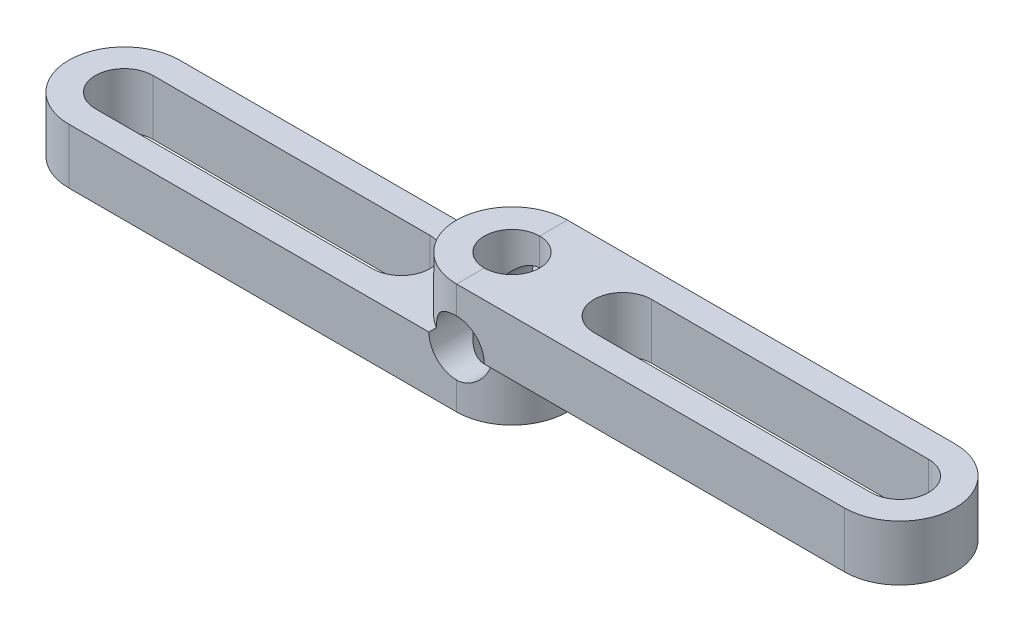
ISO-10303-21;
HEADER;
FILE_DESCRIPTION(('STEP AP214'),'2;1');
FILE_NAME('part.step','',(''),(''),'','','');
FILE_SCHEMA(('AUTOMOTIVE_DESIGN { 1 0 10303 214 1 1 1 1 }'));
ENDSEC;
DATA;
#1=APPLICATION_CONTEXT('core data for automotive mechanical design processes');
#2=APPLICATION_PROTOCOL_DEFINITION('international standard','automotive_design',2000,#1);
#3=PRODUCT_CONTEXT('',#1,'mechanical');
#4=PRODUCT('Part','Part','',(#3));
#5=PRODUCT_RELATED_PRODUCT_CATEGORY('part','',(#4));
#6=PRODUCT_DEFINITION_FORMATION('','',#4);
#7=PRODUCT_DEFINITION_CONTEXT('part definition',#1,'design');
#8=PRODUCT_DEFINITION('design','',#6,#7);
#9=PRODUCT_DEFINITION_SHAPE('','',#8);
#10=(LENGTH_UNIT() NAMED_UNIT(*) SI_UNIT(.MILLI.,.METRE.));
#11=(NAMED_UNIT(*) PLANE_ANGLE_UNIT() SI_UNIT($,.RADIAN.));
#12=(NAMED_UNIT(*) SI_UNIT($,.STERADIAN.) SOLID_ANGLE_UNIT());
#13=UNCERTAINTY_MEASURE_WITH_UNIT(LENGTH_MEASURE(1.E-05),#10,'distance_accuracy_value','');
#14=(GEOMETRIC_REPRESENTATION_CONTEXT(3) GLOBAL_UNCERTAINTY_ASSIGNED_CONTEXT((#13)) GLOBAL_UNIT_ASSIGNED_CONTEXT((#10,
#11,#12)) REPRESENTATION_CONTEXT('',''));
#15=CARTESIAN_POINT('',(0.,0.,0.));
#16=DIRECTION('',(0.,0.,1.));
#17=DIRECTION('',(1.,0.,0.));
#18=AXIS2_PLACEMENT_3D('',#15,#16,#17);
#19=CARTESIAN_POINT('',(0.,12.7,-6.35));
#20=DIRECTION('',(1.,0.,0.));
#21=DIRECTION('',(0.,0.,-1.));
#22=AXIS2_PLACEMENT_3D('',#19,#20,#21);
#23=PLANE('',#22);
#24=DIRECTION('',(0.,0.,1.));
#25=VECTOR('',#24,1.);
#26=CARTESIAN_POINT('',(0.,9.525,-6.35000000000003));
#27=LINE('',#26,#25);
#28=CARTESIAN_POINT('',(0.,9.525,-6.35000000000003));
#29=VERTEX_POINT('',#28);
#30=CARTESIAN_POINT('',(0.,9.525,-3.175));
#31=VERTEX_POINT('',#30);
#32=EDGE_CURVE('E210',#29,#31,#27,.T.);
#33=ORIENTED_EDGE('',*,*,#32,.T.);
#34=DIRECTION('',(0.,1.,0.));
#35=VECTOR('',#34,1.);
#36=CARTESIAN_POINT('',(0.,0.,-3.175));
#37=LINE('',#36,#35);
#38=CARTESIAN_POINT('',(0.,12.7,-3.175));
#39=VERTEX_POINT('',#38);
#40=EDGE_CURVE('E144',#31,#39,#37,.T.);
#41=ORIENTED_EDGE('',*,*,#40,.T.);
#42=DIRECTION('',(0.,0.,1.));
#43=VECTOR('',#42,1.);
#44=CARTESIAN_POINT('',(0.,12.7,-6.35));
#45=LINE('',#44,#43);
#46=CARTESIAN_POINT('',(0.,12.7,-6.35));
#47=VERTEX_POINT('',#46);
#48=EDGE_CURVE('E152',#47,#39,#45,.T.);
#49=ORIENTED_EDGE('',*,*,#48,.F.);
#50=DIRECTION('',(0.,-1.,0.));
#51=VECTOR('',#50,1.);
#52=CARTESIAN_POINT('',(0.,12.7,-6.35));
#53=LINE('',#52,#51);
#54=EDGE_CURVE('E172',#47,#29,#53,.T.);
#55=ORIENTED_EDGE('',*,*,#54,.T.);
#56=EDGE_LOOP('',(#33,#41,#49,#55));
#57=FACE_BOUND('',#56,.T.);
#58=ADVANCED_FACE('F53',(#57),#23,.F.);
#59=CARTESIAN_POINT('',(0.,6.35,-6.35000000000003));
#60=DIRECTION('',(0.,0.,1.));
#61=DIRECTION('',(1.,0.,0.));
#62=AXIS2_PLACEMENT_3D('',#59,#60,#61);
#63=CYLINDRICAL_SURFACE('',#62,3.175);
#64=DIRECTION('',(0.,0.,1.));
#65=VECTOR('',#64,1.);
#66=CARTESIAN_POINT('',(3.175,6.35,-6.35000000000003));
#67=LINE('',#66,#65);
#68=CARTESIAN_POINT('',(3.175,6.35,-6.35));
#69=VERTEX_POINT('',#68);
#70=CARTESIAN_POINT('',(3.175,6.35,0.));
#71=VERTEX_POINT('',#70);
#72=EDGE_CURVE('E195',#69,#71,#67,.T.);
#73=ORIENTED_EDGE('',*,*,#72,.T.);
#74=CARTESIAN_POINT('',(0.,6.35,0.));
#75=DIRECTION('',(0.,0.707106781186547,0.707106781186547));
#76=DIRECTION('',(0.,-0.707106781186547,0.707106781186547));
#77=AXIS2_PLACEMENT_3D('',#74,#75,#76);
#78=ELLIPSE('',#77,4.49012806053458,3.175);
#79=EDGE_CURVE('E12',#71,#31,#78,.T.);
#80=ORIENTED_EDGE('',*,*,#79,.T.);
#81=ORIENTED_EDGE('',*,*,#32,.F.);
#82=CARTESIAN_POINT('',(0.,6.35,-6.35000000000003));
#83=DIRECTION('',(0.,0.,1.));
#84=DIRECTION('',(1.,0.,0.));
#85=AXIS2_PLACEMENT_3D('',#82,#83,#84);
#86=CIRCLE('',#85,3.175);
#87=EDGE_CURVE('E74',#69,#29,#86,.T.);
#88=ORIENTED_EDGE('',*,*,#87,.F.);
#89=EDGE_LOOP('',(#73,#80,#81,#88));
#90=FACE_BOUND('',#89,.T.);
#91=ADVANCED_FACE('F208',(#90),#63,.F.);
#92=CARTESIAN_POINT('',(0.,12.7,3.175));
#93=VERTEX_POINT('',#92);
#94=CARTESIAN_POINT('',(0.,12.7,6.35));
#95=VERTEX_POINT('',#94);
#96=EDGE_CURVE('E149',#93,#95,#45,.T.);
#97=ORIENTED_EDGE('',*,*,#96,.F.);
#98=DIRECTION('',(0.,1.,0.));
#99=VECTOR('',#98,1.);
#100=CARTESIAN_POINT('',(0.,0.,3.175));
#101=LINE('',#100,#99);
#102=CARTESIAN_POINT('',(0.,9.525,3.175));
#103=VERTEX_POINT('',#102);
#104=EDGE_CURVE('E136',#93,#103,#101,.F.);
#105=ORIENTED_EDGE('',*,*,#104,.T.);
#106=CARTESIAN_POINT('',(0.,9.525,6.35));
#107=VERTEX_POINT('',#106);
#108=EDGE_CURVE('E201',#103,#107,#27,.T.);
#109=ORIENTED_EDGE('',*,*,#108,.T.);
#110=DIRECTION('',(0.,-1.,0.));
#111=VECTOR('',#110,1.);
#112=CARTESIAN_POINT('',(0.,12.7,6.35));
#113=LINE('',#112,#111);
#114=EDGE_CURVE('E156',#95,#107,#113,.T.);
#115=ORIENTED_EDGE('',*,*,#114,.F.);
#116=EDGE_LOOP('',(#97,#105,#109,#115));
#117=FACE_BOUND('',#116,.T.);
#118=ADVANCED_FACE('F55',(#117),#23,.F.);
#119=CARTESIAN_POINT('',(0.,12.7,6.35));
#120=DIRECTION('',(0.,0.,-1.));
#121=DIRECTION('',(-1.,0.,0.));
#122=AXIS2_PLACEMENT_3D('',#119,#120,#121);
#123=PLANE('',#122);
#124=ORIENTED_EDGE('',*,*,#114,.T.);
#125=CARTESIAN_POINT('',(0.,6.35,6.35));
#126=DIRECTION('',(0.,0.,1.));
#127=DIRECTION('',(1.,0.,0.));
#128=AXIS2_PLACEMENT_3D('',#125,#126,#127);
#129=CIRCLE('',#128,3.175);
#130=CARTESIAN_POINT('',(3.175,6.35,6.35));
#131=VERTEX_POINT('',#130);
#132=EDGE_CURVE('E219',#131,#107,#129,.T.);
#133=ORIENTED_EDGE('',*,*,#132,.F.);
#134=DIRECTION('',(1.,0.,0.));
#135=VECTOR('',#134,1.);
#136=CARTESIAN_POINT('',(0.,6.35,6.35));
#137=LINE('',#136,#135);
#138=CARTESIAN_POINT('',(44.45,6.35,6.35));
#139=VERTEX_POINT('',#138);
#140=EDGE_CURVE('E173',#131,#139,#137,.T.);
#141=ORIENTED_EDGE('',*,*,#140,.T.);
#142=DIRECTION('',(0.,-1.,0.));
#143=VECTOR('',#142,1.);
#144=CARTESIAN_POINT('',(44.45,12.7,6.35));
#145=LINE('',#144,#143);
#146=CARTESIAN_POINT('',(44.45,12.7,6.35));
#147=VERTEX_POINT('',#146);
#148=EDGE_CURVE('E181',#147,#139,#145,.T.);
#149=ORIENTED_EDGE('',*,*,#148,.F.);
#150=DIRECTION('',(1.,0.,0.));
#151=VECTOR('',#150,1.);
#152=CARTESIAN_POINT('',(0.,12.7,6.35));
#153=LINE('',#152,#151);
#154=EDGE_CURVE('E159',#95,#147,#153,.T.);
#155=ORIENTED_EDGE('',*,*,#154,.F.);
#156=EDGE_LOOP('',(#124,#133,#141,#149,#155));
#157=FACE_BOUND('',#156,.T.);
#158=ADVANCED_FACE('F269',(#157),#123,.F.);
#159=CARTESIAN_POINT('',(44.45,12.7,0.));
#160=DIRECTION('',(0.,-1.,0.));
#161=DIRECTION('',(0.,0.,-1.));
#162=AXIS2_PLACEMENT_3D('',#159,#160,#161);
#163=CYLINDRICAL_SURFACE('',#162,6.35000000000002);
#164=CARTESIAN_POINT('',(44.45,6.35,0.));
#165=DIRECTION('',(0.,1.,0.));
#166=DIRECTION('',(0.,0.,-1.));
#167=AXIS2_PLACEMENT_3D('',#164,#165,#166);
#168=CIRCLE('',#167,6.35000000000002);
#169=CARTESIAN_POINT('',(44.45,6.35,-6.35000000000003));
#170=VERTEX_POINT('',#169);
#171=EDGE_CURVE('E161',#139,#170,#168,.T.);
#172=ORIENTED_EDGE('',*,*,#171,.T.);
#173=DIRECTION('',(0.,-1.,0.));
#174=VECTOR('',#173,1.);
#175=CARTESIAN_POINT('',(44.45,12.7,-6.35000000000003));
#176=LINE('',#175,#174);
#177=CARTESIAN_POINT('',(44.45,12.7,-6.35000000000003));
#178=VERTEX_POINT('',#177);
#179=EDGE_CURVE('E178',#178,#170,#176,.T.);
#180=ORIENTED_EDGE('',*,*,#179,.F.);
#181=CARTESIAN_POINT('',(44.45,12.7,0.));
#182=DIRECTION('',(0.,1.,0.));
#183=DIRECTION('',(0.,0.,-1.));
#184=AXIS2_PLACEMENT_3D('',#181,#182,#183);
#185=CIRCLE('',#184,6.35000000000002);
#186=EDGE_CURVE('E168',#147,#178,#185,.T.);
#187=ORIENTED_EDGE('',*,*,#186,.F.);
#188=ORIENTED_EDGE('',*,*,#148,.T.);
#189=EDGE_LOOP('',(#172,#180,#187,#188));
#190=FACE_BOUND('',#189,.T.);
#191=ADVANCED_FACE('F273',(#190),#163,.T.);
#192=CARTESIAN_POINT('',(0.,12.7,-6.35));
#193=DIRECTION('',(0.,0.,1.));
#194=DIRECTION('',(1.,0.,0.));
#195=AXIS2_PLACEMENT_3D('',#192,#193,#194);
#196=PLANE('',#195);
#197=DIRECTION('',(-1.,0.,0.));
#198=VECTOR('',#197,1.);
#199=CARTESIAN_POINT('',(0.,6.35,-6.35));
#200=LINE('',#199,#198);
#201=EDGE_CURVE('E157',#170,#69,#200,.T.);
#202=ORIENTED_EDGE('',*,*,#201,.T.);
#203=ORIENTED_EDGE('',*,*,#87,.T.);
#204=ORIENTED_EDGE('',*,*,#54,.F.);
#205=DIRECTION('',(-1.,0.,0.));
#206=VECTOR('',#205,1.);
#207=CARTESIAN_POINT('',(0.,12.7,-6.35));
#208=LINE('',#207,#206);
#209=EDGE_CURVE('E170',#178,#47,#208,.T.);
#210=ORIENTED_EDGE('',*,*,#209,.F.);
#211=ORIENTED_EDGE('',*,*,#179,.T.);
#212=EDGE_LOOP('',(#202,#203,#204,#210,#211));
#213=FACE_BOUND('',#212,.T.);
#214=ADVANCED_FACE('F278',(#213),#196,.F.);
#215=CARTESIAN_POINT('',(44.45,12.7,0.));
#216=DIRECTION('',(0.,-1.,0.));
#217=DIRECTION('',(0.,0.,-1.));
#218=AXIS2_PLACEMENT_3D('',#215,#216,#217);
#219=PLANE('',#218);
#220=DIRECTION('',(-1.,0.,0.));
#221=VECTOR('',#220,1.);
#222=CARTESIAN_POINT('',(44.45,12.7,-3.302));
#223=LINE('',#222,#221);
#224=CARTESIAN_POINT('',(44.45,12.7,-3.302));
#225=VERTEX_POINT('',#224);
#226=CARTESIAN_POINT('',(12.7,12.7,-3.302));
#227=VERTEX_POINT('',#226);
#228=EDGE_CURVE('E232',#225,#227,#223,.T.);
#229=ORIENTED_EDGE('',*,*,#228,.F.);
#230=CARTESIAN_POINT('',(44.45,12.7,0.));
#231=DIRECTION('',(0.,1.,0.));
#232=DIRECTION('',(0.,0.,1.));
#233=AXIS2_PLACEMENT_3D('',#230,#231,#232);
#234=CIRCLE('',#233,3.302);
#235=CARTESIAN_POINT('',(44.45,12.7,3.302));
#236=VERTEX_POINT('',#235);
#237=EDGE_CURVE('E165',#236,#225,#234,.T.);
#238=ORIENTED_EDGE('',*,*,#237,.F.);
#239=DIRECTION('',(1.,0.,0.));
#240=VECTOR('',#239,1.);
#241=CARTESIAN_POINT('',(44.45,12.7,3.302));
#242=LINE('',#241,#240);
#243=CARTESIAN_POINT('',(12.7,12.7,3.302));
#244=VERTEX_POINT('',#243);
#245=EDGE_CURVE('E224',#244,#236,#242,.T.);
#246=ORIENTED_EDGE('',*,*,#245,.F.);
#247=CARTESIAN_POINT('',(12.7,12.7,0.));
#248=DIRECTION('',(0.,1.,0.));
#249=DIRECTION('',(0.,0.,1.));
#250=AXIS2_PLACEMENT_3D('',#247,#248,#249);
#251=CIRCLE('',#250,3.302);
#252=EDGE_CURVE('E230',#227,#244,#251,.T.);
#253=ORIENTED_EDGE('',*,*,#252,.F.);
#254=EDGE_LOOP('',(#229,#238,#246,#253));
#255=FACE_BOUND('',#254,.T.);
#256=ORIENTED_EDGE('',*,*,#48,.T.);
#257=CARTESIAN_POINT('',(0.,12.7,0.));
#258=DIRECTION('',(0.,1.,0.));
#259=DIRECTION('',(0.,0.,1.));
#260=AXIS2_PLACEMENT_3D('',#257,#258,#259);
#261=CIRCLE('',#260,3.175);
#262=EDGE_CURVE('E139',#93,#39,#261,.T.);
#263=ORIENTED_EDGE('',*,*,#262,.F.);
#264=ORIENTED_EDGE('',*,*,#96,.T.);
#265=ORIENTED_EDGE('',*,*,#154,.T.);
#266=ORIENTED_EDGE('',*,*,#186,.T.);
#267=ORIENTED_EDGE('',*,*,#209,.T.);
#268=EDGE_LOOP('',(#256,#263,#264,#265,#266,#267));
#269=FACE_BOUND('',#268,.T.);
#270=ADVANCED_FACE('F148',(#255,#269),#219,.F.);
#271=CARTESIAN_POINT('',(44.45,6.35,0.));
#272=DIRECTION('',(0.,-1.,0.));
#273=DIRECTION('',(0.,0.,-1.));
#274=AXIS2_PLACEMENT_3D('',#271,#272,#273);
#275=PLANE('',#274);
#276=ORIENTED_EDGE('',*,*,#72,.F.);
#277=ORIENTED_EDGE('',*,*,#201,.F.);
#278=ORIENTED_EDGE('',*,*,#171,.F.);
#279=ORIENTED_EDGE('',*,*,#140,.F.);
#280=EDGE_CURVE('E194',#71,#131,#67,.T.);
#281=ORIENTED_EDGE('',*,*,#280,.F.);
#282=EDGE_LOOP('',(#276,#277,#278,#279,#281));
#283=FACE_BOUND('',#282,.T.);
#284=CARTESIAN_POINT('',(44.45,6.35,0.));
#285=DIRECTION('',(0.,-1.,0.));
#286=DIRECTION('',(0.,0.,-1.));
#287=AXIS2_PLACEMENT_3D('',#284,#285,#286);
#288=CIRCLE('',#287,3.302);
#289=CARTESIAN_POINT('',(44.45,6.35,-3.302));
#290=VERTEX_POINT('',#289);
#291=CARTESIAN_POINT('',(44.45,6.35,3.302));
#292=VERTEX_POINT('',#291);
#293=EDGE_CURVE('E192',#290,#292,#288,.T.);
#294=ORIENTED_EDGE('',*,*,#293,.F.);
#295=DIRECTION('',(1.,0.,0.));
#296=VECTOR('',#295,1.);
#297=CARTESIAN_POINT('',(44.45,6.35,-3.302));
#298=LINE('',#297,#296);
#299=CARTESIAN_POINT('',(12.7,6.35,-3.302));
#300=VERTEX_POINT('',#299);
#301=EDGE_CURVE('E185',#300,#290,#298,.T.);
#302=ORIENTED_EDGE('',*,*,#301,.F.);
#303=CARTESIAN_POINT('',(12.7,6.35,0.));
#304=DIRECTION('',(0.,-1.,0.));
#305=DIRECTION('',(0.,0.,-1.));
#306=AXIS2_PLACEMENT_3D('',#303,#304,#305);
#307=CIRCLE('',#306,3.302);
#308=CARTESIAN_POINT('',(12.7,6.35,3.302));
#309=VERTEX_POINT('',#308);
#310=EDGE_CURVE('E187',#309,#300,#307,.T.);
#311=ORIENTED_EDGE('',*,*,#310,.F.);
#312=DIRECTION('',(-1.,0.,0.));
#313=VECTOR('',#312,1.);
#314=CARTESIAN_POINT('',(44.45,6.35,3.302));
#315=LINE('',#314,#313);
#316=EDGE_CURVE('E190',#292,#309,#315,.T.);
#317=ORIENTED_EDGE('',*,*,#316,.F.);
#318=EDGE_LOOP('',(#294,#302,#311,#317));
#319=FACE_BOUND('',#318,.T.);
#320=ADVANCED_FACE('F204',(#283,#319),#275,.T.);
#321=CARTESIAN_POINT('',(44.45,0.,0.));
#322=DIRECTION('',(0.,1.,0.));
#323=DIRECTION('',(0.,0.,1.));
#324=AXIS2_PLACEMENT_3D('',#321,#322,#323);
#325=CYLINDRICAL_SURFACE('',#324,3.302);
#326=ORIENTED_EDGE('',*,*,#293,.T.);
#327=DIRECTION('',(0.,1.,0.));
#328=VECTOR('',#327,1.);
#329=CARTESIAN_POINT('',(44.45,0.,3.302));
#330=LINE('',#329,#328);
#331=EDGE_CURVE('E213',#292,#236,#330,.T.);
#332=ORIENTED_EDGE('',*,*,#331,.T.);
#333=ORIENTED_EDGE('',*,*,#237,.T.);
#334=DIRECTION('',(0.,1.,0.));
#335=VECTOR('',#334,1.);
#336=CARTESIAN_POINT('',(44.45,0.,-3.302));
#337=LINE('',#336,#335);
#338=EDGE_CURVE('E221',#290,#225,#337,.T.);
#339=ORIENTED_EDGE('',*,*,#338,.F.);
#340=EDGE_LOOP('',(#326,#332,#333,#339));
#341=FACE_BOUND('',#340,.T.);
#342=ADVANCED_FACE('F240',(#341),#325,.F.);
#343=CARTESIAN_POINT('',(44.45,0.,3.302));
#344=DIRECTION('',(0.,0.,1.));
#345=DIRECTION('',(1.,0.,0.));
#346=AXIS2_PLACEMENT_3D('',#343,#344,#345);
#347=PLANE('',#346);
#348=ORIENTED_EDGE('',*,*,#316,.T.);
#349=DIRECTION('',(0.,1.,0.));
#350=VECTOR('',#349,1.);
#351=CARTESIAN_POINT('',(12.7,0.,3.302));
#352=LINE('',#351,#350);
#353=EDGE_CURVE('E215',#309,#244,#352,.T.);
#354=ORIENTED_EDGE('',*,*,#353,.T.);
#355=ORIENTED_EDGE('',*,*,#245,.T.);
#356=ORIENTED_EDGE('',*,*,#331,.F.);
#357=EDGE_LOOP('',(#348,#354,#355,#356));
#358=FACE_BOUND('',#357,.T.);
#359=ADVANCED_FACE('F253',(#358),#347,.F.);
#360=CARTESIAN_POINT('',(12.7,0.,0.));
#361=DIRECTION('',(0.,1.,0.));
#362=DIRECTION('',(0.,0.,1.));
#363=AXIS2_PLACEMENT_3D('',#360,#361,#362);
#364=CYLINDRICAL_SURFACE('',#363,3.302);
#365=ORIENTED_EDGE('',*,*,#310,.T.);
#366=DIRECTION('',(0.,1.,0.));
#367=VECTOR('',#366,1.);
#368=CARTESIAN_POINT('',(12.7,0.,-3.302));
#369=LINE('',#368,#367);
#370=EDGE_CURVE('E225',#300,#227,#369,.T.);
#371=ORIENTED_EDGE('',*,*,#370,.T.);
#372=ORIENTED_EDGE('',*,*,#252,.T.);
#373=ORIENTED_EDGE('',*,*,#353,.F.);
#374=EDGE_LOOP('',(#365,#371,#372,#373));
#375=FACE_BOUND('',#374,.T.);
#376=ADVANCED_FACE('F249',(#375),#364,.F.);
#377=CARTESIAN_POINT('',(44.45,0.,-3.302));
#378=DIRECTION('',(0.,0.,-1.));
#379=DIRECTION('',(-1.,0.,0.));
#380=AXIS2_PLACEMENT_3D('',#377,#378,#379);
#381=PLANE('',#380);
#382=ORIENTED_EDGE('',*,*,#301,.T.);
#383=ORIENTED_EDGE('',*,*,#338,.T.);
#384=ORIENTED_EDGE('',*,*,#228,.T.);
#385=ORIENTED_EDGE('',*,*,#370,.F.);
#386=EDGE_LOOP('',(#382,#383,#384,#385));
#387=FACE_BOUND('',#386,.T.);
#388=ADVANCED_FACE('F245',(#387),#381,.F.);
#389=ORIENTED_EDGE('',*,*,#108,.F.);
#390=CARTESIAN_POINT('',(0.,6.35,0.));
#391=DIRECTION('',(0.,-0.707106781186547,0.707106781186547));
#392=DIRECTION('',(0.,0.707106781186547,0.707106781186547));
#393=AXIS2_PLACEMENT_3D('',#390,#391,#392);
#394=ELLIPSE('',#393,4.49012806053458,3.175);
#395=EDGE_CURVE('E61',#103,#71,#394,.F.);
#396=ORIENTED_EDGE('',*,*,#395,.T.);
#397=ORIENTED_EDGE('',*,*,#280,.T.);
#398=ORIENTED_EDGE('',*,*,#132,.T.);
#399=EDGE_LOOP('',(#389,#396,#397,#398));
#400=FACE_BOUND('',#399,.T.);
#401=ADVANCED_FACE('F198',(#400),#63,.F.);
#402=CARTESIAN_POINT('',(0.,0.,0.));
#403=DIRECTION('',(0.,1.,0.));
#404=DIRECTION('',(0.,0.,1.));
#405=AXIS2_PLACEMENT_3D('',#402,#403,#404);
#406=CYLINDRICAL_SURFACE('',#405,3.175);
#407=ORIENTED_EDGE('',*,*,#79,.F.);
#408=ORIENTED_EDGE('',*,*,#395,.F.);
#409=ORIENTED_EDGE('',*,*,#104,.F.);
#410=ORIENTED_EDGE('',*,*,#262,.T.);
#411=ORIENTED_EDGE('',*,*,#40,.F.);
#412=EDGE_LOOP('',(#407,#408,#409,#410,#411));
#413=FACE_BOUND('',#412,.T.);
#414=ADVANCED_FACE('F138',(#413),#406,.F.);
#415=CLOSED_SHELL('',(#58,#91,#118,#158,#191,#214,#270,#320,#342,#359,#376,#388,#401,#414));
#416=MANIFOLD_SOLID_BREP('B2',#415);
#417=CARTESIAN_POINT('',(0.,6.35,-6.35));
#418=DIRECTION('',(-1.,0.,0.));
#419=DIRECTION('',(0.,0.,1.));
#420=AXIS2_PLACEMENT_3D('',#417,#418,#419);
#421=PLANE('',#420);
#422=DIRECTION('',(0.,0.,1.));
#423=VECTOR('',#422,1.);
#424=CARTESIAN_POINT('',(0.,9.525,-6.35000000000003));
#425=LINE('',#424,#423);
#426=CARTESIAN_POINT('',(0.,9.525,6.35));
#427=VERTEX_POINT('',#426);
#428=CARTESIAN_POINT('',(0.,9.525,3.175));
#429=VERTEX_POINT('',#428);
#430=EDGE_CURVE('E534',#427,#429,#425,.F.);
#431=ORIENTED_EDGE('',*,*,#430,.T.);
#432=DIRECTION('',(0.,1.,0.));
#433=VECTOR('',#432,1.);
#434=CARTESIAN_POINT('',(0.,0.,3.175));
#435=LINE('',#434,#433);
#436=CARTESIAN_POINT('',(0.,12.7,3.175));
#437=VERTEX_POINT('',#436);
#438=EDGE_CURVE('E420',#429,#437,#435,.T.);
#439=ORIENTED_EDGE('',*,*,#438,.T.);
#440=DIRECTION('',(0.,0.,1.));
#441=VECTOR('',#440,1.);
#442=CARTESIAN_POINT('',(0.,12.7,-6.35));
#443=LINE('',#442,#441);
#444=CARTESIAN_POINT('',(0.,12.7,6.35));
#445=VERTEX_POINT('',#444);
#446=EDGE_CURVE('E532',#437,#445,#443,.T.);
#447=ORIENTED_EDGE('',*,*,#446,.T.);
#448=DIRECTION('',(0.,-1.,0.));
#449=VECTOR('',#448,1.);
#450=CARTESIAN_POINT('',(0.,26.8990316571237,6.35));
#451=LINE('',#450,#449);
#452=EDGE_CURVE('E543',#445,#427,#451,.T.);
#453=ORIENTED_EDGE('',*,*,#452,.T.);
#454=EDGE_LOOP('',(#431,#439,#447,#453));
#455=FACE_BOUND('',#454,.T.);
#456=ADVANCED_FACE('F404',(#455),#421,.F.);
#457=CARTESIAN_POINT('',(0.,6.35,-6.35000000000003));
#458=DIRECTION('',(0.,0.,1.));
#459=DIRECTION('',(1.,0.,0.));
#460=AXIS2_PLACEMENT_3D('',#457,#458,#459);
#461=CYLINDRICAL_SURFACE('',#460,3.175);
#462=DIRECTION('',(0.,0.,1.));
#463=VECTOR('',#462,1.);
#464=CARTESIAN_POINT('',(3.175,6.35,-6.35000000000003));
#465=LINE('',#464,#463);
#466=CARTESIAN_POINT('',(3.175,6.35,0.));
#467=VERTEX_POINT('',#466);
#468=CARTESIAN_POINT('',(3.175,6.35,5.49926131403118));
#469=VERTEX_POINT('',#468);
#470=EDGE_CURVE('E428',#467,#469,#465,.T.);
#471=ORIENTED_EDGE('',*,*,#470,.F.);
#472=CARTESIAN_POINT('',(0.,6.35,0.));
#473=DIRECTION('',(0.,0.707106781186547,0.707106781186547));
#474=DIRECTION('',(0.,-0.707106781186547,0.707106781186547));
#475=AXIS2_PLACEMENT_3D('',#472,#473,#474);
#476=ELLIPSE('',#475,4.49012806053458,3.175);
#477=CARTESIAN_POINT('',(-3.175,6.35,0.));
#478=VERTEX_POINT('',#477);
#479=EDGE_CURVE('E413',#467,#478,#476,.F.);
#480=ORIENTED_EDGE('',*,*,#479,.T.);
#481=CARTESIAN_POINT('',(0.,6.35,0.));
#482=DIRECTION('',(0.,-0.707106781186547,0.707106781186547));
#483=DIRECTION('',(0.,0.707106781186547,0.707106781186547));
#484=AXIS2_PLACEMENT_3D('',#481,#482,#483);
#485=ELLIPSE('',#484,4.49012806053458,3.175);
#486=EDGE_CURVE('E588',#478,#429,#485,.F.);
#487=ORIENTED_EDGE('',*,*,#486,.T.);
#488=ORIENTED_EDGE('',*,*,#430,.F.);
#489=CARTESIAN_POINT('',(-3.175,6.35,5.49926131403119));
#490=CARTESIAN_POINT('',(-3.17501498719121,6.43315348587992,5.49923685344924));
#491=CARTESIAN_POINT('',(-3.17173382354071,6.51629338328758,5.50114671528612));
#492=CARTESIAN_POINT('',(-3.15869714313806,6.68184696811866,5.50865090863266));
#493=CARTESIAN_POINT('',(-3.14894560537063,6.76426107033193,5.51424297573809));
#494=CARTESIAN_POINT('',(-3.12316104774612,6.92729240975196,5.52888512683134));
#495=CARTESIAN_POINT('',(-3.10716488402458,7.00791730890421,5.53791491359291));
#496=CARTESIAN_POINT('',(-3.06910203618067,7.16728672184378,5.55909941202909));
#497=CARTESIAN_POINT('',(-3.0470346552152,7.24603101865081,5.57125448240751));
#498=CARTESIAN_POINT('',(-2.97217810239473,7.47834606130185,5.61176385358597));
#499=CARTESIAN_POINT('',(-2.91065539881639,7.62848860714425,5.64421020209745));
#500=CARTESIAN_POINT('',(-2.76639641445785,7.91643370951203,5.71629518378571));
#501=CARTESIAN_POINT('',(-2.68362637932182,8.05421615591001,5.75594523148095));
#502=CARTESIAN_POINT('',(-2.49130858676214,8.32582671333091,5.84190430348165));
#503=CARTESIAN_POINT('',(-2.38012496649006,8.45841086595671,5.88849271459742));
#504=CARTESIAN_POINT('',(-2.1375550773763,8.70399510300182,5.98081927134006));
#505=CARTESIAN_POINT('',(-2.00616259727512,8.81698914354543,6.0265571506922));
#506=CARTESIAN_POINT('',(-1.71598697928692,9.02774003354365,6.11575309314077));
#507=CARTESIAN_POINT('',(-1.55594882801386,9.12393824550256,6.15884463009568));
#508=CARTESIAN_POINT('',(-1.21952829116378,9.28738620889822,6.23416658978136));
#509=CARTESIAN_POINT('',(-1.04317169929491,9.35468072803303,6.266413791901));
#510=CARTESIAN_POINT('',(-0.722309013234585,9.44511884544687,6.31034764527068));
#511=CARTESIAN_POINT('',(-0.580090471214483,9.47492965183677,6.32508866065999));
#512=CARTESIAN_POINT('',(-0.364120576214716,9.50489391042673,6.33996545637804));
#513=CARTESIAN_POINT('',(-0.291578127175792,9.5124235028075,6.34371877316893));
#514=CARTESIAN_POINT('',(-0.146032175066976,9.52247959253627,6.34873950866554));
#515=CARTESIAN_POINT('',(-0.0730284946409638,9.52500403088201,6.35000590430856));
#516=CARTESIAN_POINT('',(0.,9.525,6.35));
#517=B_SPLINE_CURVE_WITH_KNOTS('',3,(#489,#490,#491,#492,#493,#494,#495,#496,#497,#498,#499,
#500,#501,#502,#503,#504,#505,#506,#507,#508,#509,#510,#511,#512,#513,#514,#515,#516),
.UNSPECIFIED.,.F.,.F.,(4,2,2,2,2,2,2,2,2,2,2,2,2,4),(0.,0.249351547487849,0.498549897096351,
0.746299174805496,0.99407690059086,1.4881562684498,1.98302546109986,2.51834801968003,
3.05383544141797,3.6257364287807,4.19674840052407,4.63320276318031,4.85209551942036,
5.0710783043069),.UNSPECIFIED.);
#518=CARTESIAN_POINT('',(-3.175,6.35,5.49926131403119));
#519=VERTEX_POINT('',#518);
#520=EDGE_CURVE('E646',#519,#427,#517,.T.);
#521=ORIENTED_EDGE('',*,*,#520,.F.);
#522=DIRECTION('',(0.,0.,1.));
#523=VECTOR('',#522,1.);
#524=CARTESIAN_POINT('',(-3.175,6.35,-6.35000000000003));
#525=LINE('',#524,#523);
#526=CARTESIAN_POINT('',(-3.175,6.35,6.35));
#527=VERTEX_POINT('',#526);
#528=EDGE_CURVE('E655',#519,#527,#525,.T.);
#529=ORIENTED_EDGE('',*,*,#528,.T.);
#530=CARTESIAN_POINT('',(0.,6.35,6.35));
#531=DIRECTION('',(0.,0.,1.));
#532=DIRECTION('',(1.,0.,0.));
#533=AXIS2_PLACEMENT_3D('',#530,#531,#532);
#534=CIRCLE('',#533,3.175);
#535=CARTESIAN_POINT('',(0.,3.175,6.35));
#536=VERTEX_POINT('',#535);
#537=EDGE_CURVE('E607',#527,#536,#534,.T.);
#538=ORIENTED_EDGE('',*,*,#537,.T.);
#539=CARTESIAN_POINT('',(0.,3.175,6.35));
#540=CARTESIAN_POINT('',(0.083815777936178,3.17498652928153,6.35001487958532));
#541=CARTESIAN_POINT('',(0.167622019642477,3.17831855679046,6.34834092674093));
#542=CARTESIAN_POINT('',(0.334549707072147,3.19156899744162,6.34172698474514));
#543=CARTESIAN_POINT('',(0.41767141430742,3.20148476480116,6.33678830757967));
#544=CARTESIAN_POINT('',(0.582255308885189,3.22773803761605,6.32378618963859));
#545=CARTESIAN_POINT('',(0.663723348649153,3.24404595674837,6.315737147699));
#546=CARTESIAN_POINT('',(0.82479718266169,3.28288295755716,6.29672917057541));
#547=CARTESIAN_POINT('',(0.904402861331964,3.30541242423835,6.2857700553105));
#548=CARTESIAN_POINT('',(1.13943586257729,3.38194064044946,6.24893735948025));
#549=CARTESIAN_POINT('',(1.29142048739768,3.44493467093902,6.21907983270533));
#550=CARTESIAN_POINT('',(1.58252314433977,3.59264992889178,6.15146777828733));
#551=CARTESIAN_POINT('',(1.72162798955291,3.67739309658915,6.11370528335323));
#552=CARTESIAN_POINT('',(1.99232683227261,3.87196307326943,6.03111275358125));
#553=CARTESIAN_POINT('',(2.12297197126314,3.98298823986502,5.98599488118471));
#554=CARTESIAN_POINT('',(2.36467132671337,4.22440030535366,5.89470617932503));
#555=CARTESIAN_POINT('',(2.47570965520395,4.35480275009027,5.8485345298544));
#556=CARTESIAN_POINT('',(2.68375207637458,4.64349051037696,5.75620709169399));
#557=CARTESIAN_POINT('',(2.77897647643195,4.8031595831083,5.71033562931831));
#558=CARTESIAN_POINT('',(2.94068251835112,5.13857983974442,5.62877812352088));
#559=CARTESIAN_POINT('',(3.00722572966873,5.31429558314371,5.59307031850783));
#560=CARTESIAN_POINT('',(3.09635580212754,5.6333191874841,5.54409657340162));
#561=CARTESIAN_POINT('',(3.12567043503839,5.77423517450281,5.52749644652047));
#562=CARTESIAN_POINT('',(3.15517353934339,5.9884212656585,5.51067129141979));
#563=CARTESIAN_POINT('',(3.16259670002373,6.06043883114209,5.50640834565842));
#564=CARTESIAN_POINT('',(3.17251367632964,6.20496189790494,5.50069738321041));
#565=CARTESIAN_POINT('',(3.17500482711295,6.27746764173828,5.49925088830329));
#566=CARTESIAN_POINT('',(3.175,6.35,5.49926131403118));
#567=B_SPLINE_CURVE_WITH_KNOTS('',3,(#539,#540,#541,#542,#543,#544,#545,#546,#547,#548,#549,
#550,#551,#552,#553,#554,#555,#556,#557,#558,#559,#560,#561,#562,#563,#564,#565,#566),
.UNSPECIFIED.,.F.,.F.,(4,2,2,2,2,2,2,2,2,2,2,2,2,4),(0.,0.25134856825677,0.50259618909939,
0.752694378001361,1.0028080470661,1.50200756918145,2.00171267008186,2.53134698863777,
3.0614085351851,3.63297471357157,4.20330773376952,4.63622947284826,4.85360109160646,
5.07109012763848),.UNSPECIFIED.);
#568=EDGE_CURVE('E615',#536,#469,#567,.T.);
#569=ORIENTED_EDGE('',*,*,#568,.T.);
#570=EDGE_LOOP('',(#471,#480,#487,#488,#521,#529,#538,#569));
#571=FACE_BOUND('',#570,.T.);
#572=ADVANCED_FACE('F597',(#571),#461,.F.);
#573=CARTESIAN_POINT('',(0.,12.7,-6.35));
#574=VERTEX_POINT('',#573);
#575=CARTESIAN_POINT('',(0.,12.7,-3.175));
#576=VERTEX_POINT('',#575);
#577=EDGE_CURVE('E542',#574,#576,#443,.T.);
#578=ORIENTED_EDGE('',*,*,#577,.T.);
#579=DIRECTION('',(0.,1.,0.));
#580=VECTOR('',#579,1.);
#581=CARTESIAN_POINT('',(0.,0.,-3.175));
#582=LINE('',#581,#580);
#583=CARTESIAN_POINT('',(0.,9.525,-3.175));
#584=VERTEX_POINT('',#583);
#585=EDGE_CURVE('E522',#576,#584,#582,.F.);
#586=ORIENTED_EDGE('',*,*,#585,.T.);
#587=CARTESIAN_POINT('',(0.,9.525,-6.35000000000003));
#588=VERTEX_POINT('',#587);
#589=EDGE_CURVE('E603',#584,#588,#425,.F.);
#590=ORIENTED_EDGE('',*,*,#589,.T.);
#591=DIRECTION('',(0.,-1.,0.));
#592=VECTOR('',#591,1.);
#593=CARTESIAN_POINT('',(0.,26.8990316571237,-6.35));
#594=LINE('',#593,#592);
#595=EDGE_CURVE('E547',#574,#588,#594,.T.);
#596=ORIENTED_EDGE('',*,*,#595,.F.);
#597=EDGE_LOOP('',(#578,#586,#590,#596));
#598=FACE_BOUND('',#597,.T.);
#599=ADVANCED_FACE('F406',(#598),#421,.F.);
#600=CARTESIAN_POINT('',(0.,6.35,-6.35));
#601=DIRECTION('',(0.,0.,1.));
#602=DIRECTION('',(1.,0.,0.));
#603=AXIS2_PLACEMENT_3D('',#600,#601,#602);
#604=PLANE('',#603);
#605=DIRECTION('',(-1.,0.,0.));
#606=VECTOR('',#605,1.);
#607=CARTESIAN_POINT('',(0.,6.35,-6.35));
#608=LINE('',#607,#606);
#609=CARTESIAN_POINT('',(-3.175,6.35,-6.35000000000003));
#610=VERTEX_POINT('',#609);
#611=CARTESIAN_POINT('',(-44.45,6.35,-6.34999999999998));
#612=VERTEX_POINT('',#611);
#613=EDGE_CURVE('E551',#610,#612,#608,.T.);
#614=ORIENTED_EDGE('',*,*,#613,.F.);
#615=CARTESIAN_POINT('',(0.,6.35,-6.35000000000003));
#616=DIRECTION('',(0.,0.,1.));
#617=DIRECTION('',(1.,0.,0.));
#618=AXIS2_PLACEMENT_3D('',#615,#616,#617);
#619=CIRCLE('',#618,3.175);
#620=CARTESIAN_POINT('',(0.,3.175,-6.35000000000003));
#621=VERTEX_POINT('',#620);
#622=EDGE_CURVE('E610',#610,#621,#619,.T.);
#623=ORIENTED_EDGE('',*,*,#622,.T.);
#624=DIRECTION('',(0.,-1.,0.));
#625=VECTOR('',#624,1.);
#626=CARTESIAN_POINT('',(0.,6.35,-6.35));
#627=LINE('',#626,#625);
#628=CARTESIAN_POINT('',(0.,0.,-6.35));
#629=VERTEX_POINT('',#628);
#630=EDGE_CURVE('E582',#621,#629,#627,.T.);
#631=ORIENTED_EDGE('',*,*,#630,.T.);
#632=DIRECTION('',(-1.,0.,0.));
#633=VECTOR('',#632,1.);
#634=CARTESIAN_POINT('',(0.,0.,-6.35));
#635=LINE('',#634,#633);
#636=CARTESIAN_POINT('',(-44.45,0.,-6.34999999999998));
#637=VERTEX_POINT('',#636);
#638=EDGE_CURVE('E563',#629,#637,#635,.T.);
#639=ORIENTED_EDGE('',*,*,#638,.T.);
#640=DIRECTION('',(0.,-1.,0.));
#641=VECTOR('',#640,1.);
#642=CARTESIAN_POINT('',(-44.45,6.35,-6.34999999999998));
#643=LINE('',#642,#641);
#644=EDGE_CURVE('E578',#612,#637,#643,.T.);
#645=ORIENTED_EDGE('',*,*,#644,.F.);
#646=EDGE_LOOP('',(#614,#623,#631,#639,#645));
#647=FACE_BOUND('',#646,.T.);
#648=ADVANCED_FACE('F746',(#647),#604,.F.);
#649=CARTESIAN_POINT('',(-44.45,6.35,0.));
#650=DIRECTION('',(0.,-1.,0.));
#651=DIRECTION('',(0.,0.,-1.));
#652=AXIS2_PLACEMENT_3D('',#649,#650,#651);
#653=CYLINDRICAL_SURFACE('',#652,6.34999999999999);
#654=CARTESIAN_POINT('',(-44.45,0.,0.));
#655=DIRECTION('',(0.,1.,0.));
#656=DIRECTION('',(0.,0.,1.));
#657=AXIS2_PLACEMENT_3D('',#654,#655,#656);
#658=CIRCLE('',#657,6.34999999999999);
#659=CARTESIAN_POINT('',(-44.45,0.,6.35));
#660=VERTEX_POINT('',#659);
#661=EDGE_CURVE('E566',#637,#660,#658,.T.);
#662=ORIENTED_EDGE('',*,*,#661,.T.);
#663=DIRECTION('',(0.,-1.,0.));
#664=VECTOR('',#663,1.);
#665=CARTESIAN_POINT('',(-44.45,6.35,6.35));
#666=LINE('',#665,#664);
#667=CARTESIAN_POINT('',(-44.45,6.35,6.35));
#668=VERTEX_POINT('',#667);
#669=EDGE_CURVE('E574',#668,#660,#666,.T.);
#670=ORIENTED_EDGE('',*,*,#669,.F.);
#671=CARTESIAN_POINT('',(-44.45,6.35,0.));
#672=DIRECTION('',(0.,1.,0.));
#673=DIRECTION('',(0.,0.,1.));
#674=AXIS2_PLACEMENT_3D('',#671,#672,#673);
#675=CIRCLE('',#674,6.34999999999999);
#676=EDGE_CURVE('E554',#612,#668,#675,.T.);
#677=ORIENTED_EDGE('',*,*,#676,.F.);
#678=ORIENTED_EDGE('',*,*,#644,.T.);
#679=EDGE_LOOP('',(#662,#670,#677,#678));
#680=FACE_BOUND('',#679,.T.);
#681=ADVANCED_FACE('F753',(#680),#653,.T.);
#682=CARTESIAN_POINT('',(0.,6.35,6.35));
#683=DIRECTION('',(0.,0.,-1.));
#684=DIRECTION('',(-1.,0.,0.));
#685=AXIS2_PLACEMENT_3D('',#682,#683,#684);
#686=PLANE('',#685);
#687=DIRECTION('',(0.,-1.,0.));
#688=VECTOR('',#687,1.);
#689=CARTESIAN_POINT('',(0.,6.35,6.35));
#690=LINE('',#689,#688);
#691=CARTESIAN_POINT('',(0.,0.,6.35));
#692=VERTEX_POINT('',#691);
#693=EDGE_CURVE('E562',#536,#692,#690,.T.);
#694=ORIENTED_EDGE('',*,*,#693,.F.);
#695=ORIENTED_EDGE('',*,*,#537,.F.);
#696=DIRECTION('',(1.,0.,0.));
#697=VECTOR('',#696,1.);
#698=CARTESIAN_POINT('',(0.,6.35,6.35));
#699=LINE('',#698,#697);
#700=EDGE_CURVE('E558',#668,#527,#699,.T.);
#701=ORIENTED_EDGE('',*,*,#700,.F.);
#702=ORIENTED_EDGE('',*,*,#669,.T.);
#703=DIRECTION('',(1.,0.,0.));
#704=VECTOR('',#703,1.);
#705=CARTESIAN_POINT('',(0.,0.,6.35));
#706=LINE('',#705,#704);
#707=EDGE_CURVE('E555',#660,#692,#706,.T.);
#708=ORIENTED_EDGE('',*,*,#707,.T.);
#709=EDGE_LOOP('',(#694,#695,#701,#702,#708));
#710=FACE_BOUND('',#709,.T.);
#711=ADVANCED_FACE('F757',(#710),#686,.F.);
#712=CARTESIAN_POINT('',(-44.45,6.35,0.));
#713=DIRECTION('',(0.,1.,0.));
#714=DIRECTION('',(0.,0.,1.));
#715=AXIS2_PLACEMENT_3D('',#712,#713,#714);
#716=PLANE('',#715);
#717=CARTESIAN_POINT('',(-3.175,6.35,-5.49926131403119));
#718=VERTEX_POINT('',#717);
#719=EDGE_CURVE('E674',#610,#718,#525,.T.);
#720=ORIENTED_EDGE('',*,*,#719,.F.);
#721=ORIENTED_EDGE('',*,*,#613,.T.);
#722=ORIENTED_EDGE('',*,*,#676,.T.);
#723=ORIENTED_EDGE('',*,*,#700,.T.);
#724=ORIENTED_EDGE('',*,*,#528,.F.);
#725=CARTESIAN_POINT('',(0.,6.35,0.));
#726=DIRECTION('',(0.,1.,0.));
#727=DIRECTION('',(0.,0.,1.));
#728=AXIS2_PLACEMENT_3D('',#725,#726,#727);
#729=CIRCLE('',#728,6.35);
#730=EDGE_CURVE('E723',#718,#519,#729,.T.);
#731=ORIENTED_EDGE('',*,*,#730,.F.);
#732=EDGE_LOOP('',(#720,#721,#722,#723,#724,#731));
#733=FACE_BOUND('',#732,.T.);
#734=CARTESIAN_POINT('',(-44.45,6.35,0.));
#735=DIRECTION('',(0.,1.,0.));
#736=DIRECTION('',(0.,0.,1.));
#737=AXIS2_PLACEMENT_3D('',#734,#735,#736);
#738=CIRCLE('',#737,3.30199999999999);
#739=CARTESIAN_POINT('',(-44.45,6.35,-3.30199999999999));
#740=VERTEX_POINT('',#739);
#741=CARTESIAN_POINT('',(-44.45,6.35,3.30199999999999));
#742=VERTEX_POINT('',#741);
#743=EDGE_CURVE('E715',#740,#742,#738,.T.);
#744=ORIENTED_EDGE('',*,*,#743,.F.);
#745=DIRECTION('',(-1.,0.,0.));
#746=VECTOR('',#745,1.);
#747=CARTESIAN_POINT('',(-44.45,6.35,-3.30199999999999));
#748=LINE('',#747,#746);
#749=CARTESIAN_POINT('',(-12.7,6.35,-3.30199999999999));
#750=VERTEX_POINT('',#749);
#751=EDGE_CURVE('E712',#750,#740,#748,.T.);
#752=ORIENTED_EDGE('',*,*,#751,.F.);
#753=CARTESIAN_POINT('',(-12.7,6.35,0.));
#754=DIRECTION('',(0.,1.,0.));
#755=DIRECTION('',(0.,0.,1.));
#756=AXIS2_PLACEMENT_3D('',#753,#754,#755);
#757=CIRCLE('',#756,3.30199999999999);
#758=CARTESIAN_POINT('',(-12.7,6.35,3.30199999999999));
#759=VERTEX_POINT('',#758);
#760=EDGE_CURVE('E709',#759,#750,#757,.T.);
#761=ORIENTED_EDGE('',*,*,#760,.F.);
#762=DIRECTION('',(1.,0.,0.));
#763=VECTOR('',#762,1.);
#764=CARTESIAN_POINT('',(-44.45,6.35,3.30199999999999));
#765=LINE('',#764,#763);
#766=EDGE_CURVE('E696',#742,#759,#765,.T.);
#767=ORIENTED_EDGE('',*,*,#766,.F.);
#768=EDGE_LOOP('',(#744,#752,#761,#767));
#769=FACE_BOUND('',#768,.T.);
#770=ADVANCED_FACE('F663',(#733,#769),#716,.T.);
#771=CARTESIAN_POINT('',(-44.45,0.,0.));
#772=DIRECTION('',(0.,1.,0.));
#773=DIRECTION('',(0.,0.,1.));
#774=AXIS2_PLACEMENT_3D('',#771,#772,#773);
#775=PLANE('',#774);
#776=CARTESIAN_POINT('',(0.,0.,0.));
#777=DIRECTION('',(0.,1.,0.));
#778=DIRECTION('',(0.,0.,1.));
#779=AXIS2_PLACEMENT_3D('',#776,#777,#778);
#780=CIRCLE('',#779,3.175);
#781=CARTESIAN_POINT('',(0.,0.,3.175));
#782=VERTEX_POINT('',#781);
#783=EDGE_CURVE('E527',#782,#782,#780,.T.);
#784=ORIENTED_EDGE('',*,*,#783,.T.);
#785=EDGE_LOOP('',(#784));
#786=FACE_BOUND('',#785,.T.);
#787=DIRECTION('',(-1.,0.,0.));
#788=VECTOR('',#787,1.);
#789=CARTESIAN_POINT('',(-44.45,0.,-3.30199999999999));
#790=LINE('',#789,#788);
#791=CARTESIAN_POINT('',(-12.7,0.,-3.30199999999999));
#792=VERTEX_POINT('',#791);
#793=CARTESIAN_POINT('',(-44.45,0.,-3.30199999999999));
#794=VERTEX_POINT('',#793);
#795=EDGE_CURVE('E687',#792,#794,#790,.T.);
#796=ORIENTED_EDGE('',*,*,#795,.T.);
#797=CARTESIAN_POINT('',(-44.45,0.,0.));
#798=DIRECTION('',(0.,1.,0.));
#799=DIRECTION('',(0.,0.,1.));
#800=AXIS2_PLACEMENT_3D('',#797,#798,#799);
#801=CIRCLE('',#800,3.30199999999999);
#802=CARTESIAN_POINT('',(-44.45,0.,3.30199999999999));
#803=VERTEX_POINT('',#802);
#804=EDGE_CURVE('E675',#794,#803,#801,.T.);
#805=ORIENTED_EDGE('',*,*,#804,.T.);
#806=DIRECTION('',(1.,0.,0.));
#807=VECTOR('',#806,1.);
#808=CARTESIAN_POINT('',(-44.45,0.,3.30199999999999));
#809=LINE('',#808,#807);
#810=CARTESIAN_POINT('',(-12.7,0.,3.30199999999999));
#811=VERTEX_POINT('',#810);
#812=EDGE_CURVE('E679',#803,#811,#809,.T.);
#813=ORIENTED_EDGE('',*,*,#812,.T.);
#814=CARTESIAN_POINT('',(-12.7,0.,0.));
#815=DIRECTION('',(0.,1.,0.));
#816=DIRECTION('',(0.,0.,1.));
#817=AXIS2_PLACEMENT_3D('',#814,#815,#816);
#818=CIRCLE('',#817,3.30199999999999);
#819=EDGE_CURVE('E683',#811,#792,#818,.T.);
#820=ORIENTED_EDGE('',*,*,#819,.T.);
#821=EDGE_LOOP('',(#796,#805,#813,#820));
#822=FACE_BOUND('',#821,.T.);
#823=ORIENTED_EDGE('',*,*,#638,.F.);
#824=CARTESIAN_POINT('',(0.,0.,0.));
#825=DIRECTION('',(0.,-1.,0.));
#826=DIRECTION('',(0.,0.,1.));
#827=AXIS2_PLACEMENT_3D('',#824,#825,#826);
#828=CIRCLE('',#827,6.35);
#829=EDGE_CURVE('E719',#629,#692,#828,.T.);
#830=ORIENTED_EDGE('',*,*,#829,.T.);
#831=ORIENTED_EDGE('',*,*,#707,.F.);
#832=ORIENTED_EDGE('',*,*,#661,.F.);
#833=EDGE_LOOP('',(#823,#830,#831,#832));
#834=FACE_BOUND('',#833,.T.);
#835=ADVANCED_FACE('F661',(#786,#822,#834),#775,.F.);
#836=CARTESIAN_POINT('',(0.,26.8990316571237,0.));
#837=DIRECTION('',(0.,-1.,0.));
#838=DIRECTION('',(0.,0.,-1.));
#839=AXIS2_PLACEMENT_3D('',#836,#837,#838);
#840=CYLINDRICAL_SURFACE('',#839,6.35);
#841=ORIENTED_EDGE('',*,*,#595,.T.);
#842=CARTESIAN_POINT('',(0.,9.525,-6.35));
#843=CARTESIAN_POINT('',(-0.0838157779361773,9.52501347071847,-6.35001487958532));
#844=CARTESIAN_POINT('',(-0.167622019642475,9.52168144320954,-6.34834092674093));
#845=CARTESIAN_POINT('',(-0.334549707072145,9.50843100255838,-6.34172698474514));
#846=CARTESIAN_POINT('',(-0.417671414307418,9.49851523519884,-6.33678830757967));
#847=CARTESIAN_POINT('',(-0.582255308885188,9.47226196238395,-6.32378618963859));
#848=CARTESIAN_POINT('',(-0.663723348649151,9.45595404325163,-6.315737147699));
#849=CARTESIAN_POINT('',(-0.824797182661689,9.41711704244283,-6.29672917057541));
#850=CARTESIAN_POINT('',(-0.904402861331963,9.39458757576164,-6.2857700553105));
#851=CARTESIAN_POINT('',(-1.13943586257728,9.31805935955054,-6.24893735948025));
#852=CARTESIAN_POINT('',(-1.29142048739768,9.25506532906098,-6.21907983270534));
#853=CARTESIAN_POINT('',(-1.58252314433977,9.10735007110822,-6.15146777828733));
#854=CARTESIAN_POINT('',(-1.7216279895529,9.02260690341085,-6.11370528335323));
#855=CARTESIAN_POINT('',(-1.99232683227261,8.82803692673057,-6.03111275358125));
#856=CARTESIAN_POINT('',(-2.12297197126314,8.71701176013497,-5.98599488118471));
#857=CARTESIAN_POINT('',(-2.36467132671337,8.47559969464633,-5.89470617932503));
#858=CARTESIAN_POINT('',(-2.47570965520395,8.34519724990973,-5.8485345298544));
#859=CARTESIAN_POINT('',(-2.68375207637458,8.05650948962303,-5.75620709169399));
#860=CARTESIAN_POINT('',(-2.77897647643194,7.89684041689169,-5.71033562931831));
#861=CARTESIAN_POINT('',(-2.94068251835111,7.56142016025558,-5.62877812352088));
#862=CARTESIAN_POINT('',(-3.00722572966873,7.38570441685628,-5.59307031850784));
#863=CARTESIAN_POINT('',(-3.09635580212753,7.06668081251589,-5.54409657340162));
#864=CARTESIAN_POINT('',(-3.12567043503839,6.92576482549719,-5.52749644652047));
#865=CARTESIAN_POINT('',(-3.15517353934338,6.7115787343415,-5.5106712914198));
#866=CARTESIAN_POINT('',(-3.16259670002372,6.63956116885791,-5.50640834565842));
#867=CARTESIAN_POINT('',(-3.17251367632963,6.49503810209506,-5.50069738321041));
#868=CARTESIAN_POINT('',(-3.17500482711294,6.42253235826172,-5.49925088830329));
#869=CARTESIAN_POINT('',(-3.175,6.35,-5.49926131403119));
#870=B_SPLINE_CURVE_WITH_KNOTS('',3,(#842,#843,#844,#845,#846,#847,#848,#849,#850,#851,#852,
#853,#854,#855,#856,#857,#858,#859,#860,#861,#862,#863,#864,#865,#866,#867,#868,#869),
.UNSPECIFIED.,.F.,.F.,(4,2,2,2,2,2,2,2,2,2,2,2,2,4),(0.,0.251348568256769,0.50259618909939,
0.75269437800136,1.0028080470661,1.50200756918145,2.00171267008186,2.53134698863777,
3.0614085351851,3.63297471357158,4.20330773376952,4.63622947284825,4.85360109160646,
5.07109012763847),.UNSPECIFIED.);
#871=EDGE_CURVE('E666',#588,#718,#870,.T.);
#872=ORIENTED_EDGE('',*,*,#871,.T.);
#873=ORIENTED_EDGE('',*,*,#730,.T.);
#874=ORIENTED_EDGE('',*,*,#520,.T.);
#875=ORIENTED_EDGE('',*,*,#452,.F.);
#876=CARTESIAN_POINT('',(0.,12.7,0.));
#877=DIRECTION('',(0.,-1.,0.));
#878=DIRECTION('',(0.,0.,-1.));
#879=AXIS2_PLACEMENT_3D('',#876,#877,#878);
#880=CIRCLE('',#879,6.35);
#881=EDGE_CURVE('E539',#445,#574,#880,.T.);
#882=ORIENTED_EDGE('',*,*,#881,.T.);
#883=EDGE_LOOP('',(#841,#872,#873,#874,#875,#882));
#884=FACE_BOUND('',#883,.T.);
#885=ADVANCED_FACE('F657',(#884),#840,.T.);
#886=CARTESIAN_POINT('',(44.45,12.7,0.));
#887=DIRECTION('',(0.,-1.,0.));
#888=DIRECTION('',(0.,0.,-1.));
#889=AXIS2_PLACEMENT_3D('',#886,#887,#888);
#890=PLANE('',#889);
#891=ORIENTED_EDGE('',*,*,#446,.F.);
#892=CARTESIAN_POINT('',(0.,12.7,0.));
#893=DIRECTION('',(0.,1.,0.));
#894=DIRECTION('',(0.,0.,1.));
#895=AXIS2_PLACEMENT_3D('',#892,#893,#894);
#896=CIRCLE('',#895,3.175);
#897=EDGE_CURVE('E519',#576,#437,#896,.T.);
#898=ORIENTED_EDGE('',*,*,#897,.F.);
#899=ORIENTED_EDGE('',*,*,#577,.F.);
#900=ORIENTED_EDGE('',*,*,#881,.F.);
#901=EDGE_LOOP('',(#891,#898,#899,#900));
#902=FACE_BOUND('',#901,.T.);
#903=ADVANCED_FACE('F537',(#902),#890,.F.);
#904=CARTESIAN_POINT('',(0.,20.5490316571237,0.));
#905=DIRECTION('',(0.,-1.,0.));
#906=DIRECTION('',(0.,0.,-1.));
#907=AXIS2_PLACEMENT_3D('',#904,#905,#906);
#908=CYLINDRICAL_SURFACE('',#907,6.35);
#909=CARTESIAN_POINT('',(3.175,6.35,-5.49926131403118));
#910=CARTESIAN_POINT('',(3.17501498719122,6.26684651412008,-5.49923685344924));
#911=CARTESIAN_POINT('',(3.17173382354072,6.18370661671242,-5.50114671528612));
#912=CARTESIAN_POINT('',(3.15869714313807,6.01815303188134,-5.50865090863266));
#913=CARTESIAN_POINT('',(3.14894560537063,5.93573892966807,-5.51424297573809));
#914=CARTESIAN_POINT('',(3.12316104774613,5.77270759024805,-5.52888512683134));
#915=CARTESIAN_POINT('',(3.10716488402459,5.6920826910958,-5.5379149135929));
#916=CARTESIAN_POINT('',(3.06910203618068,5.53271327815622,-5.55909941202909));
#917=CARTESIAN_POINT('',(3.04703465521521,5.4539689813492,-5.57125448240751));
#918=CARTESIAN_POINT('',(2.97217810239473,5.22165393869815,-5.61176385358597));
#919=CARTESIAN_POINT('',(2.91065539881639,5.07151139285575,-5.64421020209744));
#920=CARTESIAN_POINT('',(2.76639641445786,4.78356629048797,-5.7162951837857));
#921=CARTESIAN_POINT('',(2.68362637932183,4.64578384408999,-5.75594523148095));
#922=CARTESIAN_POINT('',(2.49130858676215,4.37417328666909,-5.84190430348165));
#923=CARTESIAN_POINT('',(2.38012496649006,4.24158913404329,-5.88849271459741));
#924=CARTESIAN_POINT('',(2.1375550773763,3.99600489699819,-5.98081927134006));
#925=CARTESIAN_POINT('',(2.00616259727513,3.88301085645458,-6.02655715069219));
#926=CARTESIAN_POINT('',(1.71598697928693,3.67225996645636,-6.11575309314076));
#927=CARTESIAN_POINT('',(1.55594882801387,3.57606175449745,-6.15884463009568));
#928=CARTESIAN_POINT('',(1.21952829116379,3.41261379110178,-6.23416658978136));
#929=CARTESIAN_POINT('',(1.04317169929492,3.34531927196697,-6.266413791901));
#930=CARTESIAN_POINT('',(0.722309013234595,3.25488115455313,-6.31034764527068));
#931=CARTESIAN_POINT('',(0.580090471214492,3.22507034816323,-6.32508866065998));
#932=CARTESIAN_POINT('',(0.364120576214723,3.19510608957327,-6.33996545637804));
#933=CARTESIAN_POINT('',(0.291578127175799,3.1875764971925,-6.34371877316893));
#934=CARTESIAN_POINT('',(0.146032175066981,3.17752040746373,-6.34873950866555));
#935=CARTESIAN_POINT('',(0.0730284946409685,3.17499596911799,-6.35000590430856));
#936=CARTESIAN_POINT('',(0.,3.175,-6.35));
#937=B_SPLINE_CURVE_WITH_KNOTS('',3,(#909,#910,#911,#912,#913,#914,#915,#916,#917,#918,#919,
#920,#921,#922,#923,#924,#925,#926,#927,#928,#929,#930,#931,#932,#933,#934,#935,#936),
.UNSPECIFIED.,.F.,.F.,(4,2,2,2,2,2,2,2,2,2,2,2,2,4),(0.,0.249351547487849,0.498549897096351,
0.746299174805494,0.994076900590858,1.4881562684498,1.98302546109986,2.51834801968002,
3.05383544141797,3.62573642878069,4.19674840052407,4.63320276318031,4.85209551942036,
5.0710783043069),.UNSPECIFIED.);
#938=CARTESIAN_POINT('',(3.175,6.35,-5.49926131403118));
#939=VERTEX_POINT('',#938);
#940=EDGE_CURVE('E625',#939,#621,#937,.T.);
#941=ORIENTED_EDGE('',*,*,#940,.F.);
#942=CARTESIAN_POINT('',(0.,6.35,0.));
#943=DIRECTION('',(0.,-1.,0.));
#944=DIRECTION('',(0.,0.,-1.));
#945=AXIS2_PLACEMENT_3D('',#942,#943,#944);
#946=CIRCLE('',#945,6.35);
#947=EDGE_CURVE('E720',#469,#939,#946,.F.);
#948=ORIENTED_EDGE('',*,*,#947,.F.);
#949=ORIENTED_EDGE('',*,*,#568,.F.);
#950=ORIENTED_EDGE('',*,*,#693,.T.);
#951=ORIENTED_EDGE('',*,*,#829,.F.);
#952=ORIENTED_EDGE('',*,*,#630,.F.);
#953=EDGE_LOOP('',(#941,#948,#949,#950,#951,#952));
#954=FACE_BOUND('',#953,.T.);
#955=ADVANCED_FACE('F631',(#954),#908,.T.);
#956=CARTESIAN_POINT('',(44.45,6.35,0.));
#957=DIRECTION('',(0.,-1.,0.));
#958=DIRECTION('',(0.,0.,-1.));
#959=AXIS2_PLACEMENT_3D('',#956,#957,#958);
#960=PLANE('',#959);
#961=ORIENTED_EDGE('',*,*,#947,.T.);
#962=EDGE_CURVE('E585',#939,#467,#465,.T.);
#963=ORIENTED_EDGE('',*,*,#962,.T.);
#964=ORIENTED_EDGE('',*,*,#470,.T.);
#965=EDGE_LOOP('',(#961,#963,#964));
#966=FACE_BOUND('',#965,.T.);
#967=ADVANCED_FACE('F763',(#966),#960,.F.);
#968=CARTESIAN_POINT('',(-44.45,0.,0.));
#969=DIRECTION('',(0.,1.,0.));
#970=DIRECTION('',(0.,0.,1.));
#971=AXIS2_PLACEMENT_3D('',#968,#969,#970);
#972=CYLINDRICAL_SURFACE('',#971,3.30199999999999);
#973=ORIENTED_EDGE('',*,*,#743,.T.);
#974=DIRECTION('',(0.,1.,0.));
#975=VECTOR('',#974,1.);
#976=CARTESIAN_POINT('',(-44.45,0.,3.30199999999999));
#977=LINE('',#976,#975);
#978=EDGE_CURVE('E691',#803,#742,#977,.T.);
#979=ORIENTED_EDGE('',*,*,#978,.F.);
#980=ORIENTED_EDGE('',*,*,#804,.F.);
#981=DIRECTION('',(0.,1.,0.));
#982=VECTOR('',#981,1.);
#983=CARTESIAN_POINT('',(-44.45,0.,-3.30199999999999));
#984=LINE('',#983,#982);
#985=EDGE_CURVE('E692',#794,#740,#984,.T.);
#986=ORIENTED_EDGE('',*,*,#985,.T.);
#987=EDGE_LOOP('',(#973,#979,#980,#986));
#988=FACE_BOUND('',#987,.T.);
#989=ADVANCED_FACE('F766',(#988),#972,.F.);
#990=CARTESIAN_POINT('',(-44.45,0.,-3.30199999999999));
#991=DIRECTION('',(0.,0.,-1.));
#992=DIRECTION('',(-1.,0.,0.));
#993=AXIS2_PLACEMENT_3D('',#990,#991,#992);
#994=PLANE('',#993);
#995=ORIENTED_EDGE('',*,*,#751,.T.);
#996=ORIENTED_EDGE('',*,*,#985,.F.);
#997=ORIENTED_EDGE('',*,*,#795,.F.);
#998=DIRECTION('',(0.,1.,0.));
#999=VECTOR('',#998,1.);
#1000=CARTESIAN_POINT('',(-12.7,0.,-3.30199999999999));
#1001=LINE('',#1000,#999);
#1002=EDGE_CURVE('E697',#792,#750,#1001,.T.);
#1003=ORIENTED_EDGE('',*,*,#1002,.T.);
#1004=EDGE_LOOP('',(#995,#996,#997,#1003));
#1005=FACE_BOUND('',#1004,.T.);
#1006=ADVANCED_FACE('F640',(#1005),#994,.F.);
#1007=CARTESIAN_POINT('',(-12.7,0.,0.));
#1008=DIRECTION('',(0.,1.,0.));
#1009=DIRECTION('',(0.,0.,1.));
#1010=AXIS2_PLACEMENT_3D('',#1007,#1008,#1009);
#1011=CYLINDRICAL_SURFACE('',#1010,3.30199999999999);
#1012=ORIENTED_EDGE('',*,*,#760,.T.);
#1013=ORIENTED_EDGE('',*,*,#1002,.F.);
#1014=ORIENTED_EDGE('',*,*,#819,.F.);
#1015=DIRECTION('',(0.,1.,0.));
#1016=VECTOR('',#1015,1.);
#1017=CARTESIAN_POINT('',(-12.7,0.,3.30199999999999));
#1018=LINE('',#1017,#1016);
#1019=EDGE_CURVE('E701',#811,#759,#1018,.T.);
#1020=ORIENTED_EDGE('',*,*,#1019,.T.);
#1021=EDGE_LOOP('',(#1012,#1013,#1014,#1020));
#1022=FACE_BOUND('',#1021,.T.);
#1023=ADVANCED_FACE('F807',(#1022),#1011,.F.);
#1024=CARTESIAN_POINT('',(-44.45,0.,3.30199999999999));
#1025=DIRECTION('',(0.,0.,1.));
#1026=DIRECTION('',(1.,0.,0.));
#1027=AXIS2_PLACEMENT_3D('',#1024,#1025,#1026);
#1028=PLANE('',#1027);
#1029=ORIENTED_EDGE('',*,*,#766,.T.);
#1030=ORIENTED_EDGE('',*,*,#1019,.F.);
#1031=ORIENTED_EDGE('',*,*,#812,.F.);
#1032=ORIENTED_EDGE('',*,*,#978,.T.);
#1033=EDGE_LOOP('',(#1029,#1030,#1031,#1032));
#1034=FACE_BOUND('',#1033,.T.);
#1035=ADVANCED_FACE('F639',(#1034),#1028,.F.);
#1036=ORIENTED_EDGE('',*,*,#589,.F.);
#1037=CARTESIAN_POINT('',(0.,6.35,0.));
#1038=DIRECTION('',(0.,0.707106781186547,0.707106781186547));
#1039=DIRECTION('',(0.,-0.707106781186547,0.707106781186547));
#1040=AXIS2_PLACEMENT_3D('',#1037,#1038,#1039);
#1041=ELLIPSE('',#1040,4.49012806053458,3.175);
#1042=EDGE_CURVE('E51',#584,#478,#1041,.T.);
#1043=ORIENTED_EDGE('',*,*,#1042,.T.);
#1044=CARTESIAN_POINT('',(0.,6.35,0.));
#1045=DIRECTION('',(0.,-0.707106781186547,0.707106781186547));
#1046=DIRECTION('',(0.,0.707106781186547,0.707106781186547));
#1047=AXIS2_PLACEMENT_3D('',#1044,#1045,#1046);
#1048=ELLIPSE('',#1047,4.49012806053458,3.175);
#1049=EDGE_CURVE('E591',#478,#467,#1048,.T.);
#1050=ORIENTED_EDGE('',*,*,#1049,.T.);
#1051=ORIENTED_EDGE('',*,*,#962,.F.);
#1052=ORIENTED_EDGE('',*,*,#940,.T.);
#1053=ORIENTED_EDGE('',*,*,#622,.F.);
#1054=ORIENTED_EDGE('',*,*,#719,.T.);
#1055=ORIENTED_EDGE('',*,*,#871,.F.);
#1056=EDGE_LOOP('',(#1036,#1043,#1050,#1051,#1052,#1053,#1054,#1055));
#1057=FACE_BOUND('',#1056,.T.);
#1058=ADVANCED_FACE('F601',(#1057),#461,.F.);
#1059=CARTESIAN_POINT('',(0.,0.,0.));
#1060=DIRECTION('',(0.,1.,0.));
#1061=DIRECTION('',(0.,0.,1.));
#1062=AXIS2_PLACEMENT_3D('',#1059,#1060,#1061);
#1063=CYLINDRICAL_SURFACE('',#1062,3.175);
#1064=ORIENTED_EDGE('',*,*,#897,.T.);
#1065=ORIENTED_EDGE('',*,*,#438,.F.);
#1066=ORIENTED_EDGE('',*,*,#486,.F.);
#1067=ORIENTED_EDGE('',*,*,#1042,.F.);
#1068=ORIENTED_EDGE('',*,*,#585,.F.);
#1069=EDGE_LOOP('',(#1064,#1065,#1066,#1067,#1068));
#1070=FACE_BOUND('',#1069,.T.);
#1071=ADVANCED_FACE('F520',(#1070),#1063,.F.);
#1072=ORIENTED_EDGE('',*,*,#783,.F.);
#1073=EDGE_LOOP('',(#1072));
#1074=FACE_BOUND('',#1073,.T.);
#1075=ORIENTED_EDGE('',*,*,#1049,.F.);
#1076=ORIENTED_EDGE('',*,*,#479,.F.);
#1077=EDGE_LOOP('',(#1075,#1076));
#1078=FACE_BOUND('',#1077,.T.);
#1079=ADVANCED_FACE('F906',(#1074,#1078),#1063,.F.);
#1080=CLOSED_SHELL('',(#456,#572,#599,#648,#681,#711,#770,#835,#885,#903,#955,#967,#989,#1006,
#1023,#1035,#1058,#1071,#1079));
#1081=MANIFOLD_SOLID_BREP('B6',#1080);
#1082=ADVANCED_BREP_SHAPE_REPRESENTATION('',(#18,#416,#1081),#14);
#1083=SHAPE_DEFINITION_REPRESENTATION(#9,#1082);
ENDSEC;
END-ISO-10303-21;
